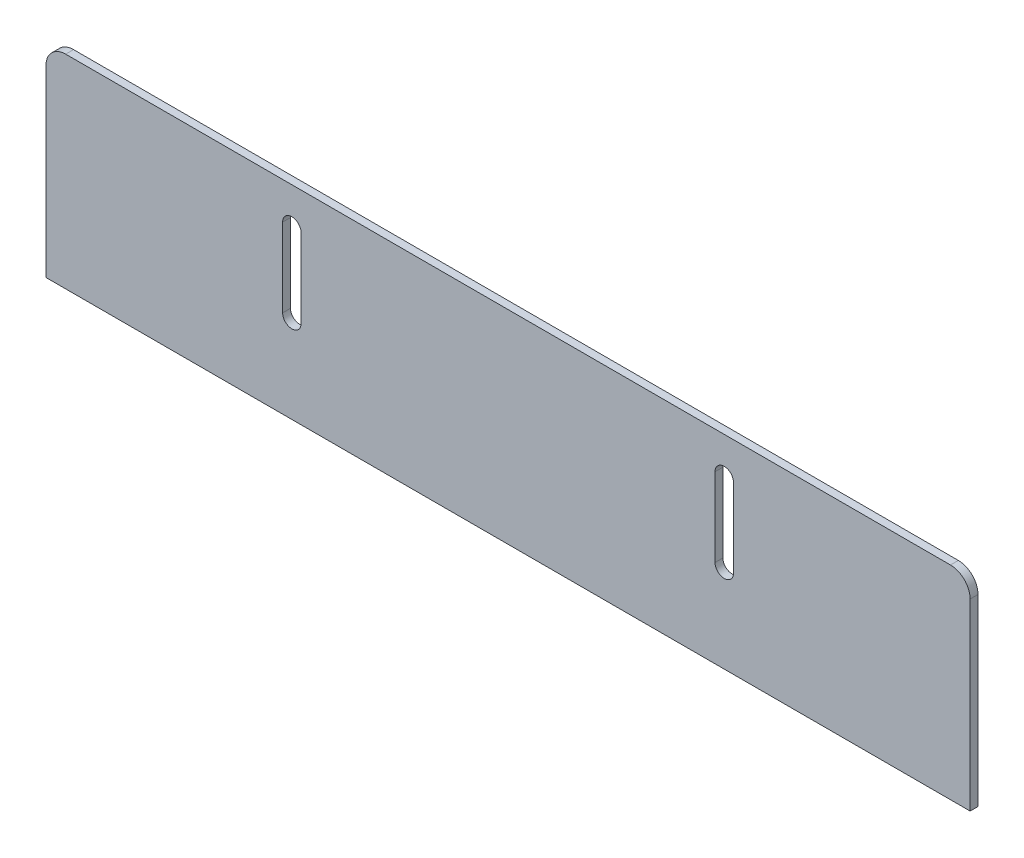
ISO-10303-21;
HEADER;
FILE_DESCRIPTION(('STEP AP214'),'2;1');
FILE_NAME('part.step','',(''),(''),'','','');
FILE_SCHEMA(('AUTOMOTIVE_DESIGN { 1 0 10303 214 1 1 1 1 }'));
ENDSEC;
DATA;
#1=APPLICATION_CONTEXT('core data for automotive mechanical design processes');
#2=APPLICATION_PROTOCOL_DEFINITION('international standard','automotive_design',2000,#1);
#3=PRODUCT_CONTEXT('',#1,'mechanical');
#4=PRODUCT('Part','Part','',(#3));
#5=PRODUCT_RELATED_PRODUCT_CATEGORY('part','',(#4));
#6=PRODUCT_DEFINITION_FORMATION('','',#4);
#7=PRODUCT_DEFINITION_CONTEXT('part definition',#1,'design');
#8=PRODUCT_DEFINITION('design','',#6,#7);
#9=PRODUCT_DEFINITION_SHAPE('','',#8);
#10=(LENGTH_UNIT() NAMED_UNIT(*) SI_UNIT(.MILLI.,.METRE.));
#11=(NAMED_UNIT(*) PLANE_ANGLE_UNIT() SI_UNIT($,.RADIAN.));
#12=(NAMED_UNIT(*) SI_UNIT($,.STERADIAN.) SOLID_ANGLE_UNIT());
#13=UNCERTAINTY_MEASURE_WITH_UNIT(LENGTH_MEASURE(1.E-05),#10,'distance_accuracy_value','');
#14=(GEOMETRIC_REPRESENTATION_CONTEXT(3) GLOBAL_UNCERTAINTY_ASSIGNED_CONTEXT((#13)) GLOBAL_UNIT_ASSIGNED_CONTEXT((#10,
#11,#12)) REPRESENTATION_CONTEXT('',''));
#15=CARTESIAN_POINT('',(0.,0.,0.));
#16=DIRECTION('',(0.,0.,1.));
#17=DIRECTION('',(1.,0.,0.));
#18=AXIS2_PLACEMENT_3D('',#15,#16,#17);
#19=CARTESIAN_POINT('',(170.199702424575,0.,2.));
#20=DIRECTION('',(1.,0.,0.));
#21=DIRECTION('',(0.,0.,-1.));
#22=AXIS2_PLACEMENT_3D('',#19,#20,#21);
#23=PLANE('',#22);
#24=DIRECTION('',(0.,-1.,0.));
#25=VECTOR('',#24,1.);
#26=CARTESIAN_POINT('',(170.199702424575,0.,0.));
#27=LINE('',#26,#25);
#28=CARTESIAN_POINT('',(170.199702424575,42.3182580335175,0.));
#29=VERTEX_POINT('',#28);
#30=CARTESIAN_POINT('',(170.199702424575,22.3182580335175,0.));
#31=VERTEX_POINT('',#30);
#32=EDGE_CURVE('E229',#29,#31,#27,.T.);
#33=ORIENTED_EDGE('',*,*,#32,.F.);
#34=DIRECTION('',(0.,0.,-1.));
#35=VECTOR('',#34,1.);
#36=CARTESIAN_POINT('',(170.199702424575,42.3182580335175,2.));
#37=LINE('',#36,#35);
#38=CARTESIAN_POINT('',(170.199702424575,42.3182580335175,2.));
#39=VERTEX_POINT('',#38);
#40=EDGE_CURVE('E11',#39,#29,#37,.T.);
#41=ORIENTED_EDGE('',*,*,#40,.F.);
#42=DIRECTION('',(0.,-1.,0.));
#43=VECTOR('',#42,1.);
#44=CARTESIAN_POINT('',(170.199702424575,0.,2.));
#45=LINE('',#44,#43);
#46=CARTESIAN_POINT('',(170.199702424575,22.3182580335175,2.));
#47=VERTEX_POINT('',#46);
#48=EDGE_CURVE('E157',#39,#47,#45,.T.);
#49=ORIENTED_EDGE('',*,*,#48,.T.);
#50=DIRECTION('',(0.,0.,-1.));
#51=VECTOR('',#50,1.);
#52=CARTESIAN_POINT('',(170.199702424575,22.3182580335175,2.));
#53=LINE('',#52,#51);
#54=EDGE_CURVE('E105',#47,#31,#53,.T.);
#55=ORIENTED_EDGE('',*,*,#54,.T.);
#56=EDGE_LOOP('',(#33,#41,#49,#55));
#57=FACE_BOUND('',#56,.T.);
#58=ADVANCED_FACE('F34',(#57),#23,.T.);
#59=CARTESIAN_POINT('',(172.550716759771,42.3182580335175,2.));
#60=DIRECTION('',(0.,0.,-1.));
#61=DIRECTION('',(-1.,0.,0.));
#62=AXIS2_PLACEMENT_3D('',#59,#60,#61);
#63=CYLINDRICAL_SURFACE('',#62,2.35101433519541);
#64=CARTESIAN_POINT('',(172.550716759771,42.3182580335175,0.));
#65=DIRECTION('',(0.,0.,1.));
#66=DIRECTION('',(1.,0.,0.));
#67=AXIS2_PLACEMENT_3D('',#64,#65,#66);
#68=CIRCLE('',#67,2.35101433519541);
#69=CARTESIAN_POINT('',(174.901731094966,42.3182580335175,0.));
#70=VERTEX_POINT('',#69);
#71=EDGE_CURVE('E162',#29,#70,#68,.F.);
#72=ORIENTED_EDGE('',*,*,#71,.T.);
#73=DIRECTION('',(0.,0.,-1.));
#74=VECTOR('',#73,1.);
#75=CARTESIAN_POINT('',(174.901731094966,42.3182580335175,2.));
#76=LINE('',#75,#74);
#77=CARTESIAN_POINT('',(174.901731094966,42.3182580335175,2.));
#78=VERTEX_POINT('',#77);
#79=EDGE_CURVE('E44',#78,#70,#76,.T.);
#80=ORIENTED_EDGE('',*,*,#79,.F.);
#81=CARTESIAN_POINT('',(172.550716759771,42.3182580335175,2.));
#82=DIRECTION('',(0.,0.,1.));
#83=DIRECTION('',(1.,0.,0.));
#84=AXIS2_PLACEMENT_3D('',#81,#82,#83);
#85=CIRCLE('',#84,2.35101433519541);
#86=EDGE_CURVE('E153',#39,#78,#85,.F.);
#87=ORIENTED_EDGE('',*,*,#86,.F.);
#88=ORIENTED_EDGE('',*,*,#40,.T.);
#89=EDGE_LOOP('',(#72,#80,#87,#88));
#90=FACE_BOUND('',#89,.T.);
#91=ADVANCED_FACE('F160',(#90),#63,.F.);
#92=CARTESIAN_POINT('',(174.901731094966,0.,2.));
#93=DIRECTION('',(1.,0.,0.));
#94=DIRECTION('',(0.,0.,-1.));
#95=AXIS2_PLACEMENT_3D('',#92,#93,#94);
#96=PLANE('',#95);
#97=DIRECTION('',(0.,-1.,0.));
#98=VECTOR('',#97,1.);
#99=CARTESIAN_POINT('',(174.901731094966,0.,0.));
#100=LINE('',#99,#98);
#101=CARTESIAN_POINT('',(174.901731094966,22.3182580335175,0.));
#102=VERTEX_POINT('',#101);
#103=EDGE_CURVE('E232',#70,#102,#100,.T.);
#104=ORIENTED_EDGE('',*,*,#103,.T.);
#105=DIRECTION('',(0.,0.,-1.));
#106=VECTOR('',#105,1.);
#107=CARTESIAN_POINT('',(174.901731094966,22.3182580335175,2.));
#108=LINE('',#107,#106);
#109=CARTESIAN_POINT('',(174.901731094966,22.3182580335175,2.));
#110=VERTEX_POINT('',#109);
#111=EDGE_CURVE('E152',#110,#102,#108,.T.);
#112=ORIENTED_EDGE('',*,*,#111,.F.);
#113=DIRECTION('',(0.,-1.,0.));
#114=VECTOR('',#113,1.);
#115=CARTESIAN_POINT('',(174.901731094966,0.,2.));
#116=LINE('',#115,#114);
#117=EDGE_CURVE('E146',#78,#110,#116,.T.);
#118=ORIENTED_EDGE('',*,*,#117,.F.);
#119=ORIENTED_EDGE('',*,*,#79,.T.);
#120=EDGE_LOOP('',(#104,#112,#118,#119));
#121=FACE_BOUND('',#120,.T.);
#122=ADVANCED_FACE('F149',(#121),#96,.F.);
#123=CARTESIAN_POINT('',(62.5507167597708,22.3182580335175,2.));
#124=DIRECTION('',(0.,0.,-1.));
#125=DIRECTION('',(-1.,0.,0.));
#126=AXIS2_PLACEMENT_3D('',#123,#124,#125);
#127=CYLINDRICAL_SURFACE('',#126,2.35101433519541);
#128=CARTESIAN_POINT('',(62.5507167597708,22.3182580335175,0.));
#129=DIRECTION('',(0.,0.,1.));
#130=DIRECTION('',(1.,0.,0.));
#131=AXIS2_PLACEMENT_3D('',#128,#129,#130);
#132=CIRCLE('',#131,2.35101433519541);
#133=CARTESIAN_POINT('',(60.1997024245754,22.3182580335175,0.));
#134=VERTEX_POINT('',#133);
#135=CARTESIAN_POINT('',(64.9017310949662,22.3182580335175,0.));
#136=VERTEX_POINT('',#135);
#137=EDGE_CURVE('E217',#134,#136,#132,.T.);
#138=ORIENTED_EDGE('',*,*,#137,.F.);
#139=DIRECTION('',(0.,0.,-1.));
#140=VECTOR('',#139,1.);
#141=CARTESIAN_POINT('',(60.1997024245754,22.3182580335175,2.));
#142=LINE('',#141,#140);
#143=CARTESIAN_POINT('',(60.1997024245754,22.3182580335175,2.));
#144=VERTEX_POINT('',#143);
#145=EDGE_CURVE('E173',#144,#134,#142,.T.);
#146=ORIENTED_EDGE('',*,*,#145,.F.);
#147=CARTESIAN_POINT('',(62.5507167597708,22.3182580335175,2.));
#148=DIRECTION('',(0.,0.,1.));
#149=DIRECTION('',(1.,0.,0.));
#150=AXIS2_PLACEMENT_3D('',#147,#148,#149);
#151=CIRCLE('',#150,2.35101433519541);
#152=CARTESIAN_POINT('',(64.9017310949662,22.3182580335175,2.));
#153=VERTEX_POINT('',#152);
#154=EDGE_CURVE('E249',#144,#153,#151,.T.);
#155=ORIENTED_EDGE('',*,*,#154,.T.);
#156=DIRECTION('',(0.,0.,-1.));
#157=VECTOR('',#156,1.);
#158=CARTESIAN_POINT('',(64.9017310949662,22.3182580335175,2.));
#159=LINE('',#158,#157);
#160=EDGE_CURVE('E167',#153,#136,#159,.T.);
#161=ORIENTED_EDGE('',*,*,#160,.T.);
#162=EDGE_LOOP('',(#138,#146,#155,#161));
#163=FACE_BOUND('',#162,.T.);
#164=ADVANCED_FACE('F290',(#163),#127,.F.);
#165=CARTESIAN_POINT('',(60.1997024245754,0.,2.));
#166=DIRECTION('',(1.,0.,0.));
#167=DIRECTION('',(0.,0.,-1.));
#168=AXIS2_PLACEMENT_3D('',#165,#166,#167);
#169=PLANE('',#168);
#170=DIRECTION('',(0.,-1.,0.));
#171=VECTOR('',#170,1.);
#172=CARTESIAN_POINT('',(60.1997024245754,0.,0.));
#173=LINE('',#172,#171);
#174=CARTESIAN_POINT('',(60.1997024245754,42.3182580335175,0.));
#175=VERTEX_POINT('',#174);
#176=EDGE_CURVE('E220',#175,#134,#173,.T.);
#177=ORIENTED_EDGE('',*,*,#176,.F.);
#178=DIRECTION('',(0.,0.,-1.));
#179=VECTOR('',#178,1.);
#180=CARTESIAN_POINT('',(60.1997024245754,42.3182580335175,2.));
#181=LINE('',#180,#179);
#182=CARTESIAN_POINT('',(60.1997024245754,42.3182580335175,2.));
#183=VERTEX_POINT('',#182);
#184=EDGE_CURVE('E171',#183,#175,#181,.T.);
#185=ORIENTED_EDGE('',*,*,#184,.F.);
#186=DIRECTION('',(0.,-1.,0.));
#187=VECTOR('',#186,1.);
#188=CARTESIAN_POINT('',(60.1997024245754,0.,2.));
#189=LINE('',#188,#187);
#190=EDGE_CURVE('E252',#183,#144,#189,.T.);
#191=ORIENTED_EDGE('',*,*,#190,.T.);
#192=ORIENTED_EDGE('',*,*,#145,.T.);
#193=EDGE_LOOP('',(#177,#185,#191,#192));
#194=FACE_BOUND('',#193,.T.);
#195=ADVANCED_FACE('F286',(#194),#169,.T.);
#196=CARTESIAN_POINT('',(62.5507167597708,42.3182580335175,2.));
#197=DIRECTION('',(0.,0.,-1.));
#198=DIRECTION('',(-1.,0.,0.));
#199=AXIS2_PLACEMENT_3D('',#196,#197,#198);
#200=CYLINDRICAL_SURFACE('',#199,2.35101433519541);
#201=CARTESIAN_POINT('',(62.5507167597708,42.3182580335175,0.));
#202=DIRECTION('',(0.,0.,1.));
#203=DIRECTION('',(1.,0.,0.));
#204=AXIS2_PLACEMENT_3D('',#201,#202,#203);
#205=CIRCLE('',#204,2.35101433519541);
#206=CARTESIAN_POINT('',(64.9017310949662,42.3182580335175,0.));
#207=VERTEX_POINT('',#206);
#208=EDGE_CURVE('E223',#207,#175,#205,.T.);
#209=ORIENTED_EDGE('',*,*,#208,.F.);
#210=DIRECTION('',(0.,0.,-1.));
#211=VECTOR('',#210,1.);
#212=CARTESIAN_POINT('',(64.9017310949662,42.3182580335175,2.));
#213=LINE('',#212,#211);
#214=CARTESIAN_POINT('',(64.9017310949662,42.3182580335175,2.));
#215=VERTEX_POINT('',#214);
#216=EDGE_CURVE('E169',#215,#207,#213,.T.);
#217=ORIENTED_EDGE('',*,*,#216,.F.);
#218=CARTESIAN_POINT('',(62.5507167597708,42.3182580335175,2.));
#219=DIRECTION('',(0.,0.,1.));
#220=DIRECTION('',(1.,0.,0.));
#221=AXIS2_PLACEMENT_3D('',#218,#219,#220);
#222=CIRCLE('',#221,2.35101433519541);
#223=EDGE_CURVE('E255',#215,#183,#222,.T.);
#224=ORIENTED_EDGE('',*,*,#223,.T.);
#225=ORIENTED_EDGE('',*,*,#184,.T.);
#226=EDGE_LOOP('',(#209,#217,#224,#225));
#227=FACE_BOUND('',#226,.T.);
#228=ADVANCED_FACE('F283',(#227),#200,.F.);
#229=CARTESIAN_POINT('',(5.,46.7223153742992,2.));
#230=DIRECTION('',(0.,0.,-1.));
#231=DIRECTION('',(-1.,0.,0.));
#232=AXIS2_PLACEMENT_3D('',#229,#230,#231);
#233=CYLINDRICAL_SURFACE('',#232,5.);
#234=CARTESIAN_POINT('',(5.,46.7223153742992,0.));
#235=DIRECTION('',(0.,0.,1.));
#236=DIRECTION('',(1.,0.,0.));
#237=AXIS2_PLACEMENT_3D('',#234,#235,#236);
#238=CIRCLE('',#237,5.);
#239=CARTESIAN_POINT('',(0.,46.7223153742991,0.));
#240=VERTEX_POINT('',#239);
#241=CARTESIAN_POINT('',(5.00000000000004,51.7223153742992,0.));
#242=VERTEX_POINT('',#241);
#243=EDGE_CURVE('E197',#240,#242,#238,.F.);
#244=ORIENTED_EDGE('',*,*,#243,.F.);
#245=DIRECTION('',(0.,0.,-1.));
#246=VECTOR('',#245,1.);
#247=CARTESIAN_POINT('',(0.,46.7223153742991,2.));
#248=LINE('',#247,#246);
#249=CARTESIAN_POINT('',(0.,46.7223153742991,2.));
#250=VERTEX_POINT('',#249);
#251=EDGE_CURVE('E38',#250,#240,#248,.T.);
#252=ORIENTED_EDGE('',*,*,#251,.F.);
#253=CARTESIAN_POINT('',(5.,46.7223153742992,2.));
#254=DIRECTION('',(0.,0.,1.));
#255=DIRECTION('',(1.,0.,0.));
#256=AXIS2_PLACEMENT_3D('',#253,#254,#255);
#257=CIRCLE('',#256,5.);
#258=CARTESIAN_POINT('',(5.00000000000004,51.7223153742992,2.));
#259=VERTEX_POINT('',#258);
#260=EDGE_CURVE('E234',#250,#259,#257,.F.);
#261=ORIENTED_EDGE('',*,*,#260,.T.);
#262=DIRECTION('',(0.,0.,-1.));
#263=VECTOR('',#262,1.);
#264=CARTESIAN_POINT('',(5.00000000000004,51.7223153742992,2.));
#265=LINE('',#264,#263);
#266=EDGE_CURVE('E175',#259,#242,#265,.T.);
#267=ORIENTED_EDGE('',*,*,#266,.T.);
#268=EDGE_LOOP('',(#244,#252,#261,#267));
#269=FACE_BOUND('',#268,.T.);
#270=ADVANCED_FACE('F36',(#269),#233,.T.);
#271=CARTESIAN_POINT('',(0.,0.,2.));
#272=DIRECTION('',(-1.,0.,0.));
#273=DIRECTION('',(0.,0.,1.));
#274=AXIS2_PLACEMENT_3D('',#271,#272,#273);
#275=PLANE('',#274);
#276=DIRECTION('',(0.,1.,0.));
#277=VECTOR('',#276,1.);
#278=CARTESIAN_POINT('',(0.,0.,0.));
#279=LINE('',#278,#277);
#280=CARTESIAN_POINT('',(0.,0.,0.));
#281=VERTEX_POINT('',#280);
#282=EDGE_CURVE('E193',#281,#240,#279,.T.);
#283=ORIENTED_EDGE('',*,*,#282,.F.);
#284=DIRECTION('',(0.,0.,-1.));
#285=VECTOR('',#284,1.);
#286=CARTESIAN_POINT('',(0.,0.,2.));
#287=LINE('',#286,#285);
#288=CARTESIAN_POINT('',(0.,0.,2.));
#289=VERTEX_POINT('',#288);
#290=EDGE_CURVE('E184',#289,#281,#287,.T.);
#291=ORIENTED_EDGE('',*,*,#290,.F.);
#292=DIRECTION('',(0.,1.,0.));
#293=VECTOR('',#292,1.);
#294=CARTESIAN_POINT('',(0.,0.,2.));
#295=LINE('',#294,#293);
#296=EDGE_CURVE('E195',#289,#250,#295,.T.);
#297=ORIENTED_EDGE('',*,*,#296,.T.);
#298=ORIENTED_EDGE('',*,*,#251,.T.);
#299=EDGE_LOOP('',(#283,#291,#297,#298));
#300=FACE_BOUND('',#299,.T.);
#301=ADVANCED_FACE('F191',(#300),#275,.T.);
#302=CARTESIAN_POINT('',(0.,0.,2.));
#303=DIRECTION('',(0.,1.,0.));
#304=DIRECTION('',(0.,0.,1.));
#305=AXIS2_PLACEMENT_3D('',#302,#303,#304);
#306=PLANE('',#305);
#307=DIRECTION('',(1.,0.,0.));
#308=VECTOR('',#307,1.);
#309=CARTESIAN_POINT('',(0.,0.,0.));
#310=LINE('',#309,#308);
#311=CARTESIAN_POINT('',(235.101433519542,0.,0.));
#312=VERTEX_POINT('',#311);
#313=EDGE_CURVE('E205',#281,#312,#310,.T.);
#314=ORIENTED_EDGE('',*,*,#313,.T.);
#315=DIRECTION('',(0.,0.,-1.));
#316=VECTOR('',#315,1.);
#317=CARTESIAN_POINT('',(235.101433519542,0.,2.));
#318=LINE('',#317,#316);
#319=CARTESIAN_POINT('',(235.101433519542,0.,2.));
#320=VERTEX_POINT('',#319);
#321=EDGE_CURVE('E182',#320,#312,#318,.T.);
#322=ORIENTED_EDGE('',*,*,#321,.F.);
#323=DIRECTION('',(1.,0.,0.));
#324=VECTOR('',#323,1.);
#325=CARTESIAN_POINT('',(0.,0.,2.));
#326=LINE('',#325,#324);
#327=EDGE_CURVE('E238',#289,#320,#326,.T.);
#328=ORIENTED_EDGE('',*,*,#327,.F.);
#329=ORIENTED_EDGE('',*,*,#290,.T.);
#330=EDGE_LOOP('',(#314,#322,#328,#329));
#331=FACE_BOUND('',#330,.T.);
#332=ADVANCED_FACE('F304',(#331),#306,.F.);
#333=CARTESIAN_POINT('',(235.101433519542,0.,2.));
#334=DIRECTION('',(-1.,0.,0.));
#335=DIRECTION('',(0.,0.,1.));
#336=AXIS2_PLACEMENT_3D('',#333,#334,#335);
#337=PLANE('',#336);
#338=DIRECTION('',(0.,1.,0.));
#339=VECTOR('',#338,1.);
#340=CARTESIAN_POINT('',(235.101433519542,0.,0.));
#341=LINE('',#340,#339);
#342=CARTESIAN_POINT('',(235.101433519542,46.7223153742991,0.));
#343=VERTEX_POINT('',#342);
#344=EDGE_CURVE('E207',#312,#343,#341,.T.);
#345=ORIENTED_EDGE('',*,*,#344,.T.);
#346=DIRECTION('',(0.,0.,-1.));
#347=VECTOR('',#346,1.);
#348=CARTESIAN_POINT('',(235.101433519542,46.7223153742991,2.));
#349=LINE('',#348,#347);
#350=CARTESIAN_POINT('',(235.101433519542,46.7223153742991,2.));
#351=VERTEX_POINT('',#350);
#352=EDGE_CURVE('E179',#351,#343,#349,.T.);
#353=ORIENTED_EDGE('',*,*,#352,.F.);
#354=DIRECTION('',(0.,1.,0.));
#355=VECTOR('',#354,1.);
#356=CARTESIAN_POINT('',(235.101433519542,0.,2.));
#357=LINE('',#356,#355);
#358=EDGE_CURVE('E242',#320,#351,#357,.T.);
#359=ORIENTED_EDGE('',*,*,#358,.F.);
#360=ORIENTED_EDGE('',*,*,#321,.T.);
#361=EDGE_LOOP('',(#345,#353,#359,#360));
#362=FACE_BOUND('',#361,.T.);
#363=ADVANCED_FACE('F300',(#362),#337,.F.);
#364=CARTESIAN_POINT('',(230.101433519542,46.7223153742992,2.));
#365=DIRECTION('',(0.,0.,-1.));
#366=DIRECTION('',(-1.,0.,0.));
#367=AXIS2_PLACEMENT_3D('',#364,#365,#366);
#368=CYLINDRICAL_SURFACE('',#367,5.);
#369=CARTESIAN_POINT('',(230.101433519542,46.7223153742992,0.));
#370=DIRECTION('',(0.,0.,1.));
#371=DIRECTION('',(1.,0.,0.));
#372=AXIS2_PLACEMENT_3D('',#369,#370,#371);
#373=CIRCLE('',#372,5.);
#374=CARTESIAN_POINT('',(230.101433519542,51.7223153742992,0.));
#375=VERTEX_POINT('',#374);
#376=EDGE_CURVE('E212',#343,#375,#373,.T.);
#377=ORIENTED_EDGE('',*,*,#376,.T.);
#378=DIRECTION('',(0.,0.,-1.));
#379=VECTOR('',#378,1.);
#380=CARTESIAN_POINT('',(230.101433519542,51.7223153742992,2.));
#381=LINE('',#380,#379);
#382=CARTESIAN_POINT('',(230.101433519542,51.7223153742992,2.));
#383=VERTEX_POINT('',#382);
#384=EDGE_CURVE('E177',#383,#375,#381,.T.);
#385=ORIENTED_EDGE('',*,*,#384,.F.);
#386=CARTESIAN_POINT('',(230.101433519542,46.7223153742992,2.));
#387=DIRECTION('',(0.,0.,1.));
#388=DIRECTION('',(1.,0.,0.));
#389=AXIS2_PLACEMENT_3D('',#386,#387,#388);
#390=CIRCLE('',#389,5.);
#391=EDGE_CURVE('E244',#351,#383,#390,.T.);
#392=ORIENTED_EDGE('',*,*,#391,.F.);
#393=ORIENTED_EDGE('',*,*,#352,.T.);
#394=EDGE_LOOP('',(#377,#385,#392,#393));
#395=FACE_BOUND('',#394,.T.);
#396=ADVANCED_FACE('F281',(#395),#368,.T.);
#397=CARTESIAN_POINT('',(64.9017310949662,0.,2.));
#398=DIRECTION('',(1.,0.,0.));
#399=DIRECTION('',(0.,0.,-1.));
#400=AXIS2_PLACEMENT_3D('',#397,#398,#399);
#401=PLANE('',#400);
#402=DIRECTION('',(0.,-1.,0.));
#403=VECTOR('',#402,1.);
#404=CARTESIAN_POINT('',(64.9017310949662,0.,0.));
#405=LINE('',#404,#403);
#406=EDGE_CURVE('E226',#207,#136,#405,.T.);
#407=ORIENTED_EDGE('',*,*,#406,.T.);
#408=ORIENTED_EDGE('',*,*,#160,.F.);
#409=DIRECTION('',(0.,-1.,0.));
#410=VECTOR('',#409,1.);
#411=CARTESIAN_POINT('',(64.9017310949662,0.,2.));
#412=LINE('',#411,#410);
#413=EDGE_CURVE('E258',#215,#153,#412,.T.);
#414=ORIENTED_EDGE('',*,*,#413,.F.);
#415=ORIENTED_EDGE('',*,*,#216,.T.);
#416=EDGE_LOOP('',(#407,#408,#414,#415));
#417=FACE_BOUND('',#416,.T.);
#418=ADVANCED_FACE('F277',(#417),#401,.F.);
#419=CARTESIAN_POINT('',(0.,51.7223153742992,2.));
#420=DIRECTION('',(0.,1.,0.));
#421=DIRECTION('',(0.,0.,1.));
#422=AXIS2_PLACEMENT_3D('',#419,#420,#421);
#423=PLANE('',#422);
#424=DIRECTION('',(1.,0.,0.));
#425=VECTOR('',#424,1.);
#426=CARTESIAN_POINT('',(0.,51.7223153742992,0.));
#427=LINE('',#426,#425);
#428=EDGE_CURVE('E215',#242,#375,#427,.T.);
#429=ORIENTED_EDGE('',*,*,#428,.F.);
#430=ORIENTED_EDGE('',*,*,#266,.F.);
#431=DIRECTION('',(1.,0.,0.));
#432=VECTOR('',#431,1.);
#433=CARTESIAN_POINT('',(0.,51.7223153742992,2.));
#434=LINE('',#433,#432);
#435=EDGE_CURVE('E246',#259,#383,#434,.T.);
#436=ORIENTED_EDGE('',*,*,#435,.T.);
#437=ORIENTED_EDGE('',*,*,#384,.T.);
#438=EDGE_LOOP('',(#429,#430,#436,#437));
#439=FACE_BOUND('',#438,.T.);
#440=ADVANCED_FACE('F280',(#439),#423,.T.);
#441=CARTESIAN_POINT('',(172.550716759771,22.3182580335175,2.));
#442=DIRECTION('',(0.,0.,-1.));
#443=DIRECTION('',(-1.,0.,0.));
#444=AXIS2_PLACEMENT_3D('',#441,#442,#443);
#445=CYLINDRICAL_SURFACE('',#444,2.35101433519541);
#446=CARTESIAN_POINT('',(172.550716759771,22.3182580335175,0.));
#447=DIRECTION('',(0.,0.,1.));
#448=DIRECTION('',(1.,0.,0.));
#449=AXIS2_PLACEMENT_3D('',#446,#447,#448);
#450=CIRCLE('',#449,2.35101433519541);
#451=EDGE_CURVE('E98',#102,#31,#450,.F.);
#452=ORIENTED_EDGE('',*,*,#451,.T.);
#453=ORIENTED_EDGE('',*,*,#54,.F.);
#454=CARTESIAN_POINT('',(172.550716759771,22.3182580335175,2.));
#455=DIRECTION('',(0.,0.,1.));
#456=DIRECTION('',(1.,0.,0.));
#457=AXIS2_PLACEMENT_3D('',#454,#455,#456);
#458=CIRCLE('',#457,2.35101433519541);
#459=EDGE_CURVE('E53',#110,#47,#458,.F.);
#460=ORIENTED_EDGE('',*,*,#459,.F.);
#461=ORIENTED_EDGE('',*,*,#111,.T.);
#462=EDGE_LOOP('',(#452,#453,#460,#461));
#463=FACE_BOUND('',#462,.T.);
#464=ADVANCED_FACE('F265',(#463),#445,.F.);
#465=CARTESIAN_POINT('',(0.,0.,2.));
#466=DIRECTION('',(0.,0.,1.));
#467=DIRECTION('',(1.,0.,0.));
#468=AXIS2_PLACEMENT_3D('',#465,#466,#467);
#469=PLANE('',#468);
#470=ORIENTED_EDGE('',*,*,#260,.F.);
#471=ORIENTED_EDGE('',*,*,#296,.F.);
#472=ORIENTED_EDGE('',*,*,#327,.T.);
#473=ORIENTED_EDGE('',*,*,#358,.T.);
#474=ORIENTED_EDGE('',*,*,#391,.T.);
#475=ORIENTED_EDGE('',*,*,#435,.F.);
#476=EDGE_LOOP('',(#470,#471,#472,#473,#474,#475));
#477=FACE_BOUND('',#476,.T.);
#478=ORIENTED_EDGE('',*,*,#154,.F.);
#479=ORIENTED_EDGE('',*,*,#190,.F.);
#480=ORIENTED_EDGE('',*,*,#223,.F.);
#481=ORIENTED_EDGE('',*,*,#413,.T.);
#482=EDGE_LOOP('',(#478,#479,#480,#481));
#483=FACE_BOUND('',#482,.T.);
#484=ORIENTED_EDGE('',*,*,#48,.F.);
#485=ORIENTED_EDGE('',*,*,#86,.T.);
#486=ORIENTED_EDGE('',*,*,#117,.T.);
#487=ORIENTED_EDGE('',*,*,#459,.T.);
#488=EDGE_LOOP('',(#484,#485,#486,#487));
#489=FACE_BOUND('',#488,.T.);
#490=ADVANCED_FACE('F156',(#477,#483,#489),#469,.T.);
#491=CARTESIAN_POINT('',(0.,0.,0.));
#492=DIRECTION('',(0.,0.,1.));
#493=DIRECTION('',(1.,0.,0.));
#494=AXIS2_PLACEMENT_3D('',#491,#492,#493);
#495=PLANE('',#494);
#496=ORIENTED_EDGE('',*,*,#243,.T.);
#497=ORIENTED_EDGE('',*,*,#428,.T.);
#498=ORIENTED_EDGE('',*,*,#376,.F.);
#499=ORIENTED_EDGE('',*,*,#344,.F.);
#500=ORIENTED_EDGE('',*,*,#313,.F.);
#501=ORIENTED_EDGE('',*,*,#282,.T.);
#502=EDGE_LOOP('',(#496,#497,#498,#499,#500,#501));
#503=FACE_BOUND('',#502,.T.);
#504=ORIENTED_EDGE('',*,*,#137,.T.);
#505=ORIENTED_EDGE('',*,*,#406,.F.);
#506=ORIENTED_EDGE('',*,*,#208,.T.);
#507=ORIENTED_EDGE('',*,*,#176,.T.);
#508=EDGE_LOOP('',(#504,#505,#506,#507));
#509=FACE_BOUND('',#508,.T.);
#510=ORIENTED_EDGE('',*,*,#32,.T.);
#511=ORIENTED_EDGE('',*,*,#451,.F.);
#512=ORIENTED_EDGE('',*,*,#103,.F.);
#513=ORIENTED_EDGE('',*,*,#71,.F.);
#514=EDGE_LOOP('',(#510,#511,#512,#513));
#515=FACE_BOUND('',#514,.T.);
#516=ADVANCED_FACE('F202',(#503,#509,#515),#495,.F.);
#517=CLOSED_SHELL('',(#58,#91,#122,#164,#195,#228,#270,#301,#332,#363,#396,#418,#440,#464,#490,#516));
#518=MANIFOLD_SOLID_BREP('B2',#517);
#519=ADVANCED_BREP_SHAPE_REPRESENTATION('',(#18,#518),#14);
#520=SHAPE_DEFINITION_REPRESENTATION(#9,#519);
ENDSEC;
END-ISO-10303-21;
